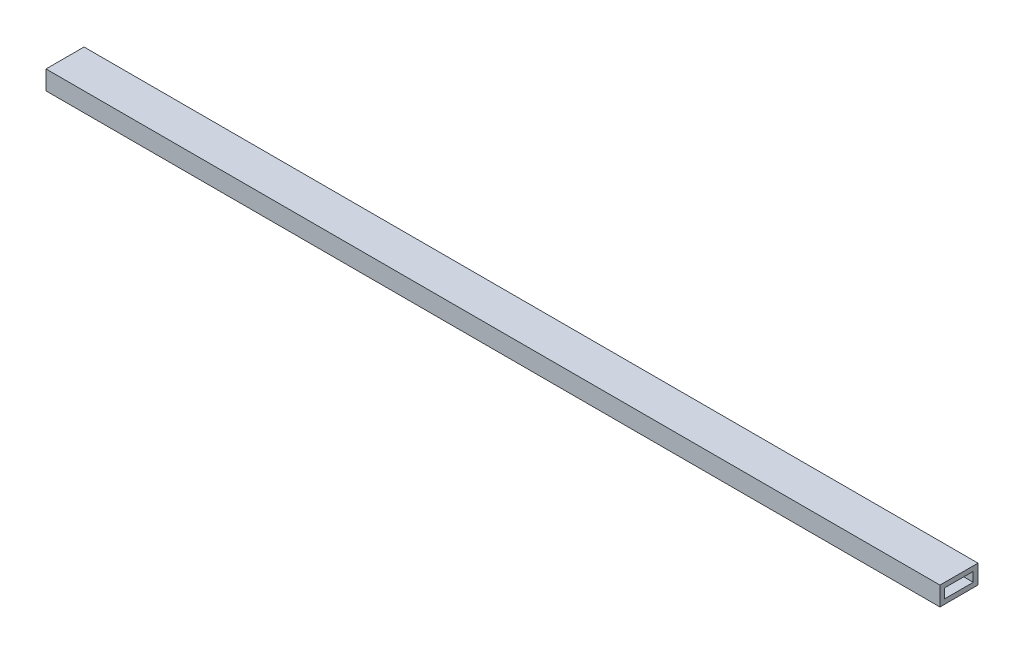
ISO-10303-21;
HEADER;
FILE_DESCRIPTION(('STEP AP214'),'2;1');
FILE_NAME('part.step','',(''),(''),'','','');
FILE_SCHEMA(('AUTOMOTIVE_DESIGN { 1 0 10303 214 1 1 1 1 }'));
ENDSEC;
DATA;
#1=APPLICATION_CONTEXT('core data for automotive mechanical design processes');
#2=APPLICATION_PROTOCOL_DEFINITION('international standard','automotive_design',2000,#1);
#3=PRODUCT_CONTEXT('',#1,'mechanical');
#4=PRODUCT('Part','Part','',(#3));
#5=PRODUCT_RELATED_PRODUCT_CATEGORY('part','',(#4));
#6=PRODUCT_DEFINITION_FORMATION('','',#4);
#7=PRODUCT_DEFINITION_CONTEXT('part definition',#1,'design');
#8=PRODUCT_DEFINITION('design','',#6,#7);
#9=PRODUCT_DEFINITION_SHAPE('','',#8);
#10=(LENGTH_UNIT() NAMED_UNIT(*) SI_UNIT(.MILLI.,.METRE.));
#11=(NAMED_UNIT(*) PLANE_ANGLE_UNIT() SI_UNIT($,.RADIAN.));
#12=(NAMED_UNIT(*) SI_UNIT($,.STERADIAN.) SOLID_ANGLE_UNIT());
#13=UNCERTAINTY_MEASURE_WITH_UNIT(LENGTH_MEASURE(1.E-05),#10,'distance_accuracy_value','');
#14=(GEOMETRIC_REPRESENTATION_CONTEXT(3) GLOBAL_UNCERTAINTY_ASSIGNED_CONTEXT((#13)) GLOBAL_UNIT_ASSIGNED_CONTEXT((#10,
#11,#12)) REPRESENTATION_CONTEXT('',''));
#15=CARTESIAN_POINT('',(0.,0.,0.));
#16=DIRECTION('',(0.,0.,1.));
#17=DIRECTION('',(1.,0.,0.));
#18=AXIS2_PLACEMENT_3D('',#15,#16,#17);
#19=CARTESIAN_POINT('',(596.9,0.,0.));
#20=DIRECTION('',(1.,0.,0.));
#21=DIRECTION('',(0.,0.,-1.));
#22=AXIS2_PLACEMENT_3D('',#19,#20,#21);
#23=PLANE('',#22);
#24=DIRECTION('',(0.,-1.,0.));
#25=VECTOR('',#24,1.);
#26=CARTESIAN_POINT('',(596.9,0.,0.));
#27=LINE('',#26,#25);
#28=CARTESIAN_POINT('',(596.9,12.7,0.));
#29=VERTEX_POINT('',#28);
#30=CARTESIAN_POINT('',(596.9,0.,0.));
#31=VERTEX_POINT('',#30);
#32=EDGE_CURVE('E160',#29,#31,#27,.T.);
#33=ORIENTED_EDGE('',*,*,#32,.T.);
#34=DIRECTION('',(0.,0.,-1.));
#35=VECTOR('',#34,1.);
#36=CARTESIAN_POINT('',(596.9,0.,0.));
#37=LINE('',#36,#35);
#38=CARTESIAN_POINT('',(596.9,0.,-25.4));
#39=VERTEX_POINT('',#38);
#40=EDGE_CURVE('E163',#31,#39,#37,.T.);
#41=ORIENTED_EDGE('',*,*,#40,.T.);
#42=DIRECTION('',(0.,1.,0.));
#43=VECTOR('',#42,1.);
#44=CARTESIAN_POINT('',(596.9,0.,-25.4));
#45=LINE('',#44,#43);
#46=CARTESIAN_POINT('',(596.9,12.7,-25.4));
#47=VERTEX_POINT('',#46);
#48=EDGE_CURVE('E166',#39,#47,#45,.T.);
#49=ORIENTED_EDGE('',*,*,#48,.T.);
#50=DIRECTION('',(0.,0.,1.));
#51=VECTOR('',#50,1.);
#52=CARTESIAN_POINT('',(596.9,12.7,0.));
#53=LINE('',#52,#51);
#54=EDGE_CURVE('E168',#47,#29,#53,.T.);
#55=ORIENTED_EDGE('',*,*,#54,.T.);
#56=EDGE_LOOP('',(#33,#41,#49,#55));
#57=FACE_BOUND('',#56,.T.);
#58=DIRECTION('',(0.,0.,-1.));
#59=VECTOR('',#58,1.);
#60=CARTESIAN_POINT('',(596.9,3.175,0.));
#61=LINE('',#60,#59);
#62=CARTESIAN_POINT('',(596.9,3.175,-3.175));
#63=VERTEX_POINT('',#62);
#64=CARTESIAN_POINT('',(596.9,3.175,-22.225));
#65=VERTEX_POINT('',#64);
#66=EDGE_CURVE('E132',#63,#65,#61,.T.);
#67=ORIENTED_EDGE('',*,*,#66,.F.);
#68=DIRECTION('',(0.,-1.,0.));
#69=VECTOR('',#68,1.);
#70=CARTESIAN_POINT('',(596.9,0.,-3.175));
#71=LINE('',#70,#69);
#72=CARTESIAN_POINT('',(596.9,9.525,-3.175));
#73=VERTEX_POINT('',#72);
#74=EDGE_CURVE('E124',#73,#63,#71,.T.);
#75=ORIENTED_EDGE('',*,*,#74,.F.);
#76=DIRECTION('',(0.,0.,1.));
#77=VECTOR('',#76,1.);
#78=CARTESIAN_POINT('',(596.9,9.525,0.));
#79=LINE('',#78,#77);
#80=CARTESIAN_POINT('',(596.9,9.525,-22.225));
#81=VERTEX_POINT('',#80);
#82=EDGE_CURVE('E146',#81,#73,#79,.T.);
#83=ORIENTED_EDGE('',*,*,#82,.F.);
#84=DIRECTION('',(0.,1.,0.));
#85=VECTOR('',#84,1.);
#86=CARTESIAN_POINT('',(596.9,0.,-22.225));
#87=LINE('',#86,#85);
#88=EDGE_CURVE('E144',#65,#81,#87,.T.);
#89=ORIENTED_EDGE('',*,*,#88,.F.);
#90=EDGE_LOOP('',(#67,#75,#83,#89));
#91=FACE_BOUND('',#90,.T.);
#92=ADVANCED_FACE('F59',(#57,#91),#23,.T.);
#93=CARTESIAN_POINT('',(0.,0.,0.));
#94=DIRECTION('',(1.,0.,0.));
#95=DIRECTION('',(0.,0.,-1.));
#96=AXIS2_PLACEMENT_3D('',#93,#94,#95);
#97=PLANE('',#96);
#98=DIRECTION('',(0.,-1.,0.));
#99=VECTOR('',#98,1.);
#100=CARTESIAN_POINT('',(0.,0.,0.));
#101=LINE('',#100,#99);
#102=CARTESIAN_POINT('',(0.,12.7,0.));
#103=VERTEX_POINT('',#102);
#104=CARTESIAN_POINT('',(0.,0.,0.));
#105=VERTEX_POINT('',#104);
#106=EDGE_CURVE('E140',#103,#105,#101,.T.);
#107=ORIENTED_EDGE('',*,*,#106,.F.);
#108=DIRECTION('',(0.,0.,1.));
#109=VECTOR('',#108,1.);
#110=CARTESIAN_POINT('',(0.,12.7,0.));
#111=LINE('',#110,#109);
#112=CARTESIAN_POINT('',(0.,12.7,-25.4));
#113=VERTEX_POINT('',#112);
#114=EDGE_CURVE('E164',#113,#103,#111,.T.);
#115=ORIENTED_EDGE('',*,*,#114,.F.);
#116=DIRECTION('',(0.,1.,0.));
#117=VECTOR('',#116,1.);
#118=CARTESIAN_POINT('',(0.,0.,-25.4));
#119=LINE('',#118,#117);
#120=CARTESIAN_POINT('',(0.,0.,-25.4));
#121=VERTEX_POINT('',#120);
#122=EDGE_CURVE('E175',#121,#113,#119,.T.);
#123=ORIENTED_EDGE('',*,*,#122,.F.);
#124=DIRECTION('',(0.,0.,-1.));
#125=VECTOR('',#124,1.);
#126=CARTESIAN_POINT('',(0.,0.,0.));
#127=LINE('',#126,#125);
#128=EDGE_CURVE('E173',#105,#121,#127,.T.);
#129=ORIENTED_EDGE('',*,*,#128,.F.);
#130=EDGE_LOOP('',(#107,#115,#123,#129));
#131=FACE_BOUND('',#130,.T.);
#132=DIRECTION('',(0.,-1.,0.));
#133=VECTOR('',#132,1.);
#134=CARTESIAN_POINT('',(0.,0.,-3.175));
#135=LINE('',#134,#133);
#136=CARTESIAN_POINT('',(0.,9.525,-3.175));
#137=VERTEX_POINT('',#136);
#138=CARTESIAN_POINT('',(0.,3.175,-3.175));
#139=VERTEX_POINT('',#138);
#140=EDGE_CURVE('E82',#137,#139,#135,.T.);
#141=ORIENTED_EDGE('',*,*,#140,.T.);
#142=DIRECTION('',(0.,0.,-1.));
#143=VECTOR('',#142,1.);
#144=CARTESIAN_POINT('',(0.,3.175,0.));
#145=LINE('',#144,#143);
#146=CARTESIAN_POINT('',(0.,3.175,-22.225));
#147=VERTEX_POINT('',#146);
#148=EDGE_CURVE('E139',#139,#147,#145,.T.);
#149=ORIENTED_EDGE('',*,*,#148,.T.);
#150=DIRECTION('',(0.,1.,0.));
#151=VECTOR('',#150,1.);
#152=CARTESIAN_POINT('',(0.,0.,-22.225));
#153=LINE('',#152,#151);
#154=CARTESIAN_POINT('',(0.,9.525,-22.225));
#155=VERTEX_POINT('',#154);
#156=EDGE_CURVE('E152',#147,#155,#153,.T.);
#157=ORIENTED_EDGE('',*,*,#156,.T.);
#158=DIRECTION('',(0.,0.,1.));
#159=VECTOR('',#158,1.);
#160=CARTESIAN_POINT('',(0.,9.525,0.));
#161=LINE('',#160,#159);
#162=EDGE_CURVE('E133',#155,#137,#161,.T.);
#163=ORIENTED_EDGE('',*,*,#162,.T.);
#164=EDGE_LOOP('',(#141,#149,#157,#163));
#165=FACE_BOUND('',#164,.T.);
#166=ADVANCED_FACE('F193',(#131,#165),#97,.F.);
#167=CARTESIAN_POINT('',(596.9,0.,0.));
#168=DIRECTION('',(0.,0.,-1.));
#169=DIRECTION('',(-1.,0.,0.));
#170=AXIS2_PLACEMENT_3D('',#167,#168,#169);
#171=PLANE('',#170);
#172=ORIENTED_EDGE('',*,*,#106,.T.);
#173=DIRECTION('',(-1.,0.,0.));
#174=VECTOR('',#173,1.);
#175=CARTESIAN_POINT('',(596.9,0.,0.));
#176=LINE('',#175,#174);
#177=EDGE_CURVE('E12',#31,#105,#176,.T.);
#178=ORIENTED_EDGE('',*,*,#177,.F.);
#179=ORIENTED_EDGE('',*,*,#32,.F.);
#180=DIRECTION('',(-1.,0.,0.));
#181=VECTOR('',#180,1.);
#182=CARTESIAN_POINT('',(596.9,12.7,0.));
#183=LINE('',#182,#181);
#184=EDGE_CURVE('E170',#29,#103,#183,.T.);
#185=ORIENTED_EDGE('',*,*,#184,.T.);
#186=EDGE_LOOP('',(#172,#178,#179,#185));
#187=FACE_BOUND('',#186,.T.);
#188=ADVANCED_FACE('F61',(#187),#171,.F.);
#189=CARTESIAN_POINT('',(596.9,0.,0.));
#190=DIRECTION('',(0.,1.,0.));
#191=DIRECTION('',(0.,0.,1.));
#192=AXIS2_PLACEMENT_3D('',#189,#190,#191);
#193=PLANE('',#192);
#194=ORIENTED_EDGE('',*,*,#128,.T.);
#195=DIRECTION('',(-1.,0.,0.));
#196=VECTOR('',#195,1.);
#197=CARTESIAN_POINT('',(596.9,0.,-25.4));
#198=LINE('',#197,#196);
#199=EDGE_CURVE('E67',#39,#121,#198,.T.);
#200=ORIENTED_EDGE('',*,*,#199,.F.);
#201=ORIENTED_EDGE('',*,*,#40,.F.);
#202=ORIENTED_EDGE('',*,*,#177,.T.);
#203=EDGE_LOOP('',(#194,#200,#201,#202));
#204=FACE_BOUND('',#203,.T.);
#205=ADVANCED_FACE('F203',(#204),#193,.F.);
#206=CARTESIAN_POINT('',(596.9,0.,-25.4));
#207=DIRECTION('',(0.,0.,1.));
#208=DIRECTION('',(1.,0.,0.));
#209=AXIS2_PLACEMENT_3D('',#206,#207,#208);
#210=PLANE('',#209);
#211=ORIENTED_EDGE('',*,*,#122,.T.);
#212=DIRECTION('',(-1.,0.,0.));
#213=VECTOR('',#212,1.);
#214=CARTESIAN_POINT('',(596.9,12.7,-25.4));
#215=LINE('',#214,#213);
#216=EDGE_CURVE('E180',#47,#113,#215,.T.);
#217=ORIENTED_EDGE('',*,*,#216,.F.);
#218=ORIENTED_EDGE('',*,*,#48,.F.);
#219=ORIENTED_EDGE('',*,*,#199,.T.);
#220=EDGE_LOOP('',(#211,#217,#218,#219));
#221=FACE_BOUND('',#220,.T.);
#222=ADVANCED_FACE('F187',(#221),#210,.F.);
#223=CARTESIAN_POINT('',(596.9,12.7,0.));
#224=DIRECTION('',(0.,-1.,0.));
#225=DIRECTION('',(0.,0.,-1.));
#226=AXIS2_PLACEMENT_3D('',#223,#224,#225);
#227=PLANE('',#226);
#228=ORIENTED_EDGE('',*,*,#114,.T.);
#229=ORIENTED_EDGE('',*,*,#184,.F.);
#230=ORIENTED_EDGE('',*,*,#54,.F.);
#231=ORIENTED_EDGE('',*,*,#216,.T.);
#232=EDGE_LOOP('',(#228,#229,#230,#231));
#233=FACE_BOUND('',#232,.T.);
#234=ADVANCED_FACE('F197',(#233),#227,.F.);
#235=CARTESIAN_POINT('',(596.9,0.,-3.175));
#236=DIRECTION('',(0.,0.,-1.));
#237=DIRECTION('',(-1.,0.,0.));
#238=AXIS2_PLACEMENT_3D('',#235,#236,#237);
#239=PLANE('',#238);
#240=ORIENTED_EDGE('',*,*,#140,.F.);
#241=DIRECTION('',(-1.,0.,0.));
#242=VECTOR('',#241,1.);
#243=CARTESIAN_POINT('',(596.9,9.525,-3.175));
#244=LINE('',#243,#242);
#245=EDGE_CURVE('E128',#73,#137,#244,.T.);
#246=ORIENTED_EDGE('',*,*,#245,.F.);
#247=ORIENTED_EDGE('',*,*,#74,.T.);
#248=DIRECTION('',(-1.,0.,0.));
#249=VECTOR('',#248,1.);
#250=CARTESIAN_POINT('',(596.9,3.175,-3.175));
#251=LINE('',#250,#249);
#252=EDGE_CURVE('E127',#63,#139,#251,.T.);
#253=ORIENTED_EDGE('',*,*,#252,.T.);
#254=EDGE_LOOP('',(#240,#246,#247,#253));
#255=FACE_BOUND('',#254,.T.);
#256=ADVANCED_FACE('F126',(#255),#239,.T.);
#257=CARTESIAN_POINT('',(596.9,3.175,0.));
#258=DIRECTION('',(0.,1.,0.));
#259=DIRECTION('',(0.,0.,1.));
#260=AXIS2_PLACEMENT_3D('',#257,#258,#259);
#261=PLANE('',#260);
#262=ORIENTED_EDGE('',*,*,#148,.F.);
#263=ORIENTED_EDGE('',*,*,#252,.F.);
#264=ORIENTED_EDGE('',*,*,#66,.T.);
#265=DIRECTION('',(-1.,0.,0.));
#266=VECTOR('',#265,1.);
#267=CARTESIAN_POINT('',(596.9,3.175,-22.225));
#268=LINE('',#267,#266);
#269=EDGE_CURVE('E141',#65,#147,#268,.T.);
#270=ORIENTED_EDGE('',*,*,#269,.T.);
#271=EDGE_LOOP('',(#262,#263,#264,#270));
#272=FACE_BOUND('',#271,.T.);
#273=ADVANCED_FACE('F136',(#272),#261,.T.);
#274=CARTESIAN_POINT('',(596.9,0.,-22.225));
#275=DIRECTION('',(0.,0.,1.));
#276=DIRECTION('',(1.,0.,0.));
#277=AXIS2_PLACEMENT_3D('',#274,#275,#276);
#278=PLANE('',#277);
#279=ORIENTED_EDGE('',*,*,#156,.F.);
#280=ORIENTED_EDGE('',*,*,#269,.F.);
#281=ORIENTED_EDGE('',*,*,#88,.T.);
#282=DIRECTION('',(-1.,0.,0.));
#283=VECTOR('',#282,1.);
#284=CARTESIAN_POINT('',(596.9,9.525,-22.225));
#285=LINE('',#284,#283);
#286=EDGE_CURVE('E74',#81,#155,#285,.T.);
#287=ORIENTED_EDGE('',*,*,#286,.T.);
#288=EDGE_LOOP('',(#279,#280,#281,#287));
#289=FACE_BOUND('',#288,.T.);
#290=ADVANCED_FACE('F226',(#289),#278,.T.);
#291=CARTESIAN_POINT('',(596.9,9.525,0.));
#292=DIRECTION('',(0.,-1.,0.));
#293=DIRECTION('',(0.,0.,-1.));
#294=AXIS2_PLACEMENT_3D('',#291,#292,#293);
#295=PLANE('',#294);
#296=ORIENTED_EDGE('',*,*,#162,.F.);
#297=ORIENTED_EDGE('',*,*,#286,.F.);
#298=ORIENTED_EDGE('',*,*,#82,.T.);
#299=ORIENTED_EDGE('',*,*,#245,.T.);
#300=EDGE_LOOP('',(#296,#297,#298,#299));
#301=FACE_BOUND('',#300,.T.);
#302=ADVANCED_FACE('F230',(#301),#295,.T.);
#303=CLOSED_SHELL('',(#92,#166,#188,#205,#222,#234,#256,#273,#290,#302));
#304=MANIFOLD_SOLID_BREP('B2',#303);
#305=ADVANCED_BREP_SHAPE_REPRESENTATION('',(#18,#304),#14);
#306=SHAPE_DEFINITION_REPRESENTATION(#9,#305);
ENDSEC;
END-ISO-10303-21;
